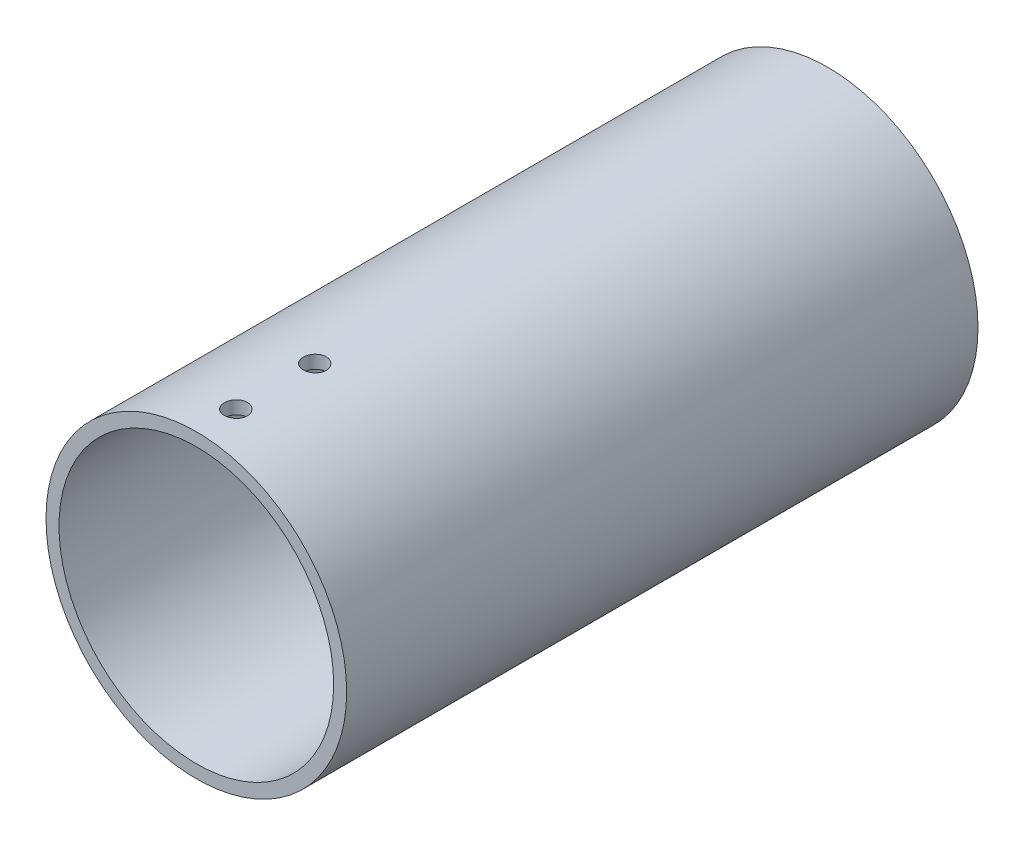
ISO-10303-21;
HEADER;
FILE_DESCRIPTION(('STEP AP214'),'2;1');
FILE_NAME('part.step','',(''),(''),'','','');
FILE_SCHEMA(('AUTOMOTIVE_DESIGN { 1 0 10303 214 1 1 1 1 }'));
ENDSEC;
DATA;
#1=APPLICATION_CONTEXT('core data for automotive mechanical design processes');
#2=APPLICATION_PROTOCOL_DEFINITION('international standard','automotive_design',2000,#1);
#3=PRODUCT_CONTEXT('',#1,'mechanical');
#4=PRODUCT('Part','Part','',(#3));
#5=PRODUCT_RELATED_PRODUCT_CATEGORY('part','',(#4));
#6=PRODUCT_DEFINITION_FORMATION('','',#4);
#7=PRODUCT_DEFINITION_CONTEXT('part definition',#1,'design');
#8=PRODUCT_DEFINITION('design','',#6,#7);
#9=PRODUCT_DEFINITION_SHAPE('','',#8);
#10=(LENGTH_UNIT() NAMED_UNIT(*) SI_UNIT(.MILLI.,.METRE.));
#11=(NAMED_UNIT(*) PLANE_ANGLE_UNIT() SI_UNIT($,.RADIAN.));
#12=(NAMED_UNIT(*) SI_UNIT($,.STERADIAN.) SOLID_ANGLE_UNIT());
#13=UNCERTAINTY_MEASURE_WITH_UNIT(LENGTH_MEASURE(1.E-05),#10,'distance_accuracy_value','');
#14=(GEOMETRIC_REPRESENTATION_CONTEXT(3) GLOBAL_UNCERTAINTY_ASSIGNED_CONTEXT((#13)) GLOBAL_UNIT_ASSIGNED_CONTEXT((#10,
#11,#12)) REPRESENTATION_CONTEXT('',''));
#15=CARTESIAN_POINT('',(0.,0.,0.));
#16=DIRECTION('',(0.,0.,1.));
#17=DIRECTION('',(1.,0.,0.));
#18=AXIS2_PLACEMENT_3D('',#15,#16,#17);
#19=CARTESIAN_POINT('',(0.,0.,80.));
#20=DIRECTION('',(0.,0.,-1.));
#21=DIRECTION('',(-1.,0.,0.));
#22=AXIS2_PLACEMENT_3D('',#19,#20,#21);
#23=CYLINDRICAL_SURFACE('',#22,19.05);
#24=CARTESIAN_POINT('',(0.,0.,80.));
#25=DIRECTION('',(0.,0.,1.));
#26=DIRECTION('',(1.,0.,0.));
#27=AXIS2_PLACEMENT_3D('',#24,#25,#26);
#28=CIRCLE('',#27,19.05);
#29=CARTESIAN_POINT('',(19.05,0.,80.));
#30=VERTEX_POINT('',#29);
#31=EDGE_CURVE('E10',#30,#30,#28,.T.);
#32=ORIENTED_EDGE('',*,*,#31,.F.);
#33=EDGE_LOOP('',(#32));
#34=FACE_BOUND('',#33,.T.);
#35=CARTESIAN_POINT('',(0.,0.,0.));
#36=DIRECTION('',(0.,0.,1.));
#37=DIRECTION('',(1.,0.,0.));
#38=AXIS2_PLACEMENT_3D('',#35,#36,#37);
#39=CIRCLE('',#38,19.05);
#40=CARTESIAN_POINT('',(19.05,0.,0.));
#41=VERTEX_POINT('',#40);
#42=EDGE_CURVE('E46',#41,#41,#39,.T.);
#43=ORIENTED_EDGE('',*,*,#42,.T.);
#44=EDGE_LOOP('',(#43));
#45=FACE_BOUND('',#44,.T.);
#46=CARTESIAN_POINT('',(0.,19.05,63.55));
#47=CARTESIAN_POINT('',(-0.0813208494830457,19.0499992729257,63.5500035622873));
#48=CARTESIAN_POINT('',(-0.162697657982737,19.0494737272168,63.5568641206488));
#49=CARTESIAN_POINT('',(-0.323201460018307,19.0474277490183,63.5841321941853));
#50=CARTESIAN_POINT('',(-0.402325770014953,19.0459061777403,63.604555216153));
#51=CARTESIAN_POINT('',(-0.55597663122478,19.0420401637007,63.6583557255923));
#52=CARTESIAN_POINT('',(-0.630505691202798,19.0396961746977,63.691726070616));
#53=CARTESIAN_POINT('',(-0.77288617027345,19.0344484812242,63.7704616268439));
#54=CARTESIAN_POINT('',(-0.840739051379646,19.0315448997125,63.8158242038162));
#55=CARTESIAN_POINT('',(-0.96800550226609,19.0254970660228,63.9173623582976));
#56=CARTESIAN_POINT('',(-1.02740275286289,19.0223523660085,63.9735583651256));
#57=CARTESIAN_POINT('',(-1.13593198857298,19.0161805027123,64.0951252971086));
#58=CARTESIAN_POINT('',(-1.1850635312591,19.0131533445007,64.1604966174945));
#59=CARTESIAN_POINT('',(-1.27172050512056,19.0075543319599,64.2986554965038));
#60=CARTESIAN_POINT('',(-1.30923182211138,19.0049830329354,64.3714519323571));
#61=CARTESIAN_POINT('',(-1.37149333961383,19.0005917241333,64.5223326242051));
#62=CARTESIAN_POINT('',(-1.39624373199115,18.9987717030601,64.6004168006764));
#63=CARTESIAN_POINT('',(-1.43223407702103,18.9960925982056,64.7594946824739));
#64=CARTESIAN_POINT('',(-1.44350033286174,18.9952316438237,64.8404824048563));
#65=CARTESIAN_POINT('',(-1.45228383416612,18.9945621706972,65.0032036226505));
#66=CARTESIAN_POINT('',(-1.44980129885398,18.9947536351718,65.0849371061504));
#67=CARTESIAN_POINT('',(-1.43117945518972,18.996165673315,65.2466498703818));
#68=CARTESIAN_POINT('',(-1.41506868528936,18.997384096443,65.3266324588216));
#69=CARTESIAN_POINT('',(-1.36969200884703,19.0007093805456,65.4827548875062));
#70=CARTESIAN_POINT('',(-1.34042599254899,19.0028162489325,65.5588946956841));
#71=CARTESIAN_POINT('',(-1.26953745571371,19.0076834950449,65.7052614679711));
#72=CARTESIAN_POINT('',(-1.2279020774928,19.0104445521777,65.7754821813221));
#73=CARTESIAN_POINT('',(-1.13346597695597,19.016308410931,65.9079491096538));
#74=CARTESIAN_POINT('',(-1.08066506656583,19.0194112183075,65.9701951902799));
#75=CARTESIAN_POINT('',(-0.965236408537407,19.0256185114098,66.085111890507));
#76=CARTESIAN_POINT('',(-0.902583979241591,19.0287229812888,66.1377577225386));
#77=CARTESIAN_POINT('',(-0.769317019785275,19.0345762326859,66.2317880249525));
#78=CARTESIAN_POINT('',(-0.698702485388893,19.0373250140149,66.2731724893436));
#79=CARTESIAN_POINT('',(-0.551500096726652,19.0421575652253,66.3435035516848));
#80=CARTESIAN_POINT('',(-0.474911744763708,19.0442412796243,66.372449112001));
#81=CARTESIAN_POINT('',(-0.31794291823663,19.0475082402431,66.4170636560945));
#82=CARTESIAN_POINT('',(-0.237562509351747,19.0486915020529,66.4327328697319));
#83=CARTESIAN_POINT('',(-0.0755062059068249,19.0500222298809,66.4503189890923));
#84=CARTESIAN_POINT('',(0.0061659515649958,19.0501722755637,66.4522701453969));
#85=CARTESIAN_POINT('',(0.168676276613854,19.0494265437844,66.4424544002631));
#86=CARTESIAN_POINT('',(0.249514450658992,19.0485307744395,66.4306876052975));
#87=CARTESIAN_POINT('',(0.407964896263582,19.045795849195,66.3937983509771));
#88=CARTESIAN_POINT('',(0.485580870568152,19.0439578104614,66.3686917062295));
#89=CARTESIAN_POINT('',(0.635498227366434,19.0395449388627,66.3058515549985));
#90=CARTESIAN_POINT('',(0.707799539388619,19.0369700962298,66.2681178811197));
#91=CARTESIAN_POINT('',(0.845191443970697,19.0313660777045,66.1810082959473));
#92=CARTESIAN_POINT('',(0.910267569227839,19.0283360178592,66.1316096241153));
#93=CARTESIAN_POINT('',(1.03121594136035,19.022165184916,66.0226052625939));
#94=CARTESIAN_POINT('',(1.08708805471953,19.0190244102128,65.962999424862));
#95=CARTESIAN_POINT('',(1.18815933385557,19.0129785526043,65.8351244163525));
#96=CARTESIAN_POINT('',(1.23333619816994,19.0100739703333,65.766837591767));
#97=CARTESIAN_POINT('',(1.31158180279568,19.0048361620861,65.6236272112266));
#98=CARTESIAN_POINT('',(1.34465064669224,19.0025029312221,65.548703712056));
#99=CARTESIAN_POINT('',(1.39770327759728,18.9986746155864,65.3944266933331));
#100=CARTESIAN_POINT('',(1.41770086172064,18.9971786472991,65.3150779411332));
#101=CARTESIAN_POINT('',(1.44408828980572,18.9951911506433,65.1541372037776));
#102=CARTESIAN_POINT('',(1.45047834703204,18.994699606533,65.0725452537989));
#103=CARTESIAN_POINT('',(1.44946703905592,18.9947767883759,64.909655870581));
#104=CARTESIAN_POINT('',(1.44210072032826,18.9953428199948,64.8283582161707));
#105=CARTESIAN_POINT('',(1.41385868610037,18.9974656557984,64.6681580513888));
#106=CARTESIAN_POINT('',(1.39298294834949,18.9990224616148,64.5892555449622));
#107=CARTESIAN_POINT('',(1.33832320082262,19.002950733469,64.4360820932478));
#108=CARTESIAN_POINT('',(1.30453965494641,19.005322170229,64.3618109816216));
#109=CARTESIAN_POINT('',(1.22502744089685,19.0106125193006,64.2199893470956));
#110=CARTESIAN_POINT('',(1.17929900616275,19.0135314209129,64.1524386928933));
#111=CARTESIAN_POINT('',(1.07706377742759,19.019596598861,64.0257964955096));
#112=CARTESIAN_POINT('',(1.02053118152052,19.0227434080684,63.9667258073963));
#113=CARTESIAN_POINT('',(0.898336147686061,19.0289050209962,63.8588896422513));
#114=CARTESIAN_POINT('',(0.832671494924629,19.0319197924589,63.8101266724432));
#115=CARTESIAN_POINT('',(0.693969654148835,19.0374821834565,63.724236122242));
#116=CARTESIAN_POINT('',(0.62092068394173,19.0400290375594,63.6871275372988));
#117=CARTESIAN_POINT('',(0.469660629150879,19.0443592659936,63.6257490146474));
#118=CARTESIAN_POINT('',(0.391455639531667,19.0461435237588,63.601464213431));
#119=CARTESIAN_POINT('',(0.260652232296499,19.0482858536481,63.5726557124547));
#120=CARTESIAN_POINT('',(0.208896734831719,19.0489257586698,63.5641709957713));
#121=CARTESIAN_POINT('',(0.10476856756679,19.0497830656221,63.5528419980021));
#122=CARTESIAN_POINT('',(0.0523958990948468,19.0500004684618,63.5499977047799));
#123=CARTESIAN_POINT('',(0.,19.05,63.55));
#124=B_SPLINE_CURVE_WITH_KNOTS('',3,(#46,#47,#48,#49,#50,#51,#52,#53,#54,#55,#56,#57,#58,#59,
#60,#61,#62,#63,#64,#65,#66,#67,#68,#69,#70,#71,#72,#73,#74,#75,#76,#77,#78,#79,#80,#81,#82,#83,
#84,#85,#86,#87,#88,#89,#90,#91,#92,#93,#94,#95,#96,#97,#98,#99,#100,#101,#102,#103,#104,#105,
#106,#107,#108,#109,#110,#111,#112,#113,#114,#115,#116,#117,#118,#119,#120,#121,#122,#123),
.UNSPECIFIED.,.T.,.F.,(4,2,2,2,2,2,2,2,2,2,2,2,2,2,2,2,2,2,2,2,2,2,2,2,2,2,2,2,2,2,2,2,2,2,2,2,
2,2,4),(0.,0.243771256204985,0.487821711956081,0.73173772718129,0.975600207898734,
1.21992713605075,1.46426459193112,1.70889767229548,1.95352707439461,2.19767850184943,
2.44182603632608,2.68546357126808,2.92910313895,3.17299685612479,3.41689468181602,
3.66141359364039,3.9059326355507,4.15047207089759,4.39500727232226,4.6389317125782,
4.88285425961241,5.12648827564305,5.37012552163721,5.61424213463201,5.85836228854453,
6.10298707837145,6.34760977536262,6.59197384684753,6.836334088497,7.08007263414094,
7.32381158123454,7.56754176930334,7.81126719450392,8.05558211388458,8.29995639160803,
8.54472693165783,8.78921314228026,8.94627792586699,9.10334237149848),.UNSPECIFIED.);
#125=CARTESIAN_POINT('',(0.,19.05,63.55));
#126=VERTEX_POINT('',#125);
#127=EDGE_CURVE('E62',#126,#126,#124,.T.);
#128=ORIENTED_EDGE('',*,*,#127,.F.);
#129=EDGE_LOOP('',(#128));
#130=FACE_BOUND('',#129,.T.);
#131=CARTESIAN_POINT('',(0.,19.05,73.55));
#132=CARTESIAN_POINT('',(-0.0813208494830448,19.0499992729257,73.5500035622873));
#133=CARTESIAN_POINT('',(-0.162697657982736,19.0494737272168,73.5568641206488));
#134=CARTESIAN_POINT('',(-0.323201460018307,19.0474277490183,73.5841321941853));
#135=CARTESIAN_POINT('',(-0.402325770014951,19.0459061777403,73.604555216153));
#136=CARTESIAN_POINT('',(-0.555976631224778,19.0420401637007,73.6583557255923));
#137=CARTESIAN_POINT('',(-0.630505691202798,19.0396961746977,73.691726070616));
#138=CARTESIAN_POINT('',(-0.772886170273451,19.0344484812242,73.7704616268439));
#139=CARTESIAN_POINT('',(-0.840739051379648,19.0315448997125,73.8158242038162));
#140=CARTESIAN_POINT('',(-0.968005502266088,19.0254970660228,73.9173623582976));
#141=CARTESIAN_POINT('',(-1.02740275286289,19.0223523660085,73.9735583651256));
#142=CARTESIAN_POINT('',(-1.13593198857298,19.0161805027123,74.0951252971086));
#143=CARTESIAN_POINT('',(-1.18506353125909,19.0131533445007,74.1604966174945));
#144=CARTESIAN_POINT('',(-1.27172050512056,19.0075543319599,74.2986554965038));
#145=CARTESIAN_POINT('',(-1.30923182211138,19.0049830329354,74.3714519323571));
#146=CARTESIAN_POINT('',(-1.37149333961383,19.0005917241333,74.5223326242051));
#147=CARTESIAN_POINT('',(-1.39624373199116,18.9987717030601,74.6004168006764));
#148=CARTESIAN_POINT('',(-1.43223407702103,18.9960925982056,74.7594946824739));
#149=CARTESIAN_POINT('',(-1.44350033286174,18.9952316438237,74.8404824048563));
#150=CARTESIAN_POINT('',(-1.45228383416612,18.9945621706972,75.0032036226505));
#151=CARTESIAN_POINT('',(-1.44980129885398,18.9947536351718,75.0849371061504));
#152=CARTESIAN_POINT('',(-1.43117945518972,18.996165673315,75.2466498703818));
#153=CARTESIAN_POINT('',(-1.41506868528936,18.997384096443,75.3266324588216));
#154=CARTESIAN_POINT('',(-1.36969200884702,19.0007093805456,75.4827548875062));
#155=CARTESIAN_POINT('',(-1.34042599254899,19.0028162489325,75.5588946956841));
#156=CARTESIAN_POINT('',(-1.26953745571371,19.0076834950449,75.7052614679711));
#157=CARTESIAN_POINT('',(-1.2279020774928,19.0104445521777,75.7754821813221));
#158=CARTESIAN_POINT('',(-1.13346597695596,19.016308410931,75.9079491096538));
#159=CARTESIAN_POINT('',(-1.08066506656583,19.0194112183075,75.9701951902799));
#160=CARTESIAN_POINT('',(-0.965236408537409,19.0256185114098,76.0851118905069));
#161=CARTESIAN_POINT('',(-0.90258397924159,19.0287229812888,76.1377577225386));
#162=CARTESIAN_POINT('',(-0.769317019785273,19.0345762326859,76.2317880249525));
#163=CARTESIAN_POINT('',(-0.698702485388895,19.0373250140149,76.2731724893436));
#164=CARTESIAN_POINT('',(-0.551500096726656,19.0421575652253,76.3435035516848));
#165=CARTESIAN_POINT('',(-0.474911744763709,19.0442412796243,76.372449112001));
#166=CARTESIAN_POINT('',(-0.317942918236631,19.0475082402431,76.4170636560945));
#167=CARTESIAN_POINT('',(-0.237562509351749,19.0486915020529,76.4327328697319));
#168=CARTESIAN_POINT('',(-0.0755062059068279,19.0500222298809,76.4503189890923));
#169=CARTESIAN_POINT('',(0.00616595156499384,19.0501722755637,76.4522701453969));
#170=CARTESIAN_POINT('',(0.168676276613854,19.0494265437844,76.4424544002631));
#171=CARTESIAN_POINT('',(0.249514450658992,19.0485307744395,76.4306876052975));
#172=CARTESIAN_POINT('',(0.407964896263583,19.045795849195,76.3937983509771));
#173=CARTESIAN_POINT('',(0.485580870568153,19.0439578104614,76.3686917062295));
#174=CARTESIAN_POINT('',(0.635498227366438,19.0395449388627,76.3058515549985));
#175=CARTESIAN_POINT('',(0.707799539388626,19.0369700962298,76.2681178811197));
#176=CARTESIAN_POINT('',(0.845191443970698,19.0313660777045,76.1810082959474));
#177=CARTESIAN_POINT('',(0.910267569227833,19.0283360178592,76.1316096241153));
#178=CARTESIAN_POINT('',(1.03121594136034,19.022165184916,76.0226052625939));
#179=CARTESIAN_POINT('',(1.08708805471954,19.0190244102128,75.962999424862));
#180=CARTESIAN_POINT('',(1.18815933385557,19.0129785526043,75.8351244163525));
#181=CARTESIAN_POINT('',(1.23333619816994,19.0100739703333,75.766837591767));
#182=CARTESIAN_POINT('',(1.31158180279568,19.0048361620861,75.6236272112266));
#183=CARTESIAN_POINT('',(1.34465064669224,19.0025029312221,75.548703712056));
#184=CARTESIAN_POINT('',(1.39770327759728,18.9986746155864,75.3944266933331));
#185=CARTESIAN_POINT('',(1.41770086172064,18.9971786472991,75.3150779411332));
#186=CARTESIAN_POINT('',(1.44408828980573,18.9951911506433,75.1541372037776));
#187=CARTESIAN_POINT('',(1.45047834703205,18.994699606533,75.0725452537989));
#188=CARTESIAN_POINT('',(1.44946703905593,18.9947767883759,74.909655870581));
#189=CARTESIAN_POINT('',(1.44210072032827,18.9953428199948,74.8283582161707));
#190=CARTESIAN_POINT('',(1.41385868610037,18.9974656557984,74.6681580513888));
#191=CARTESIAN_POINT('',(1.3929829483495,18.9990224616148,74.5892555449622));
#192=CARTESIAN_POINT('',(1.33832320082263,19.002950733469,74.4360820932478));
#193=CARTESIAN_POINT('',(1.30453965494641,19.005322170229,74.3618109816216));
#194=CARTESIAN_POINT('',(1.22502744089686,19.0106125193006,74.2199893470956));
#195=CARTESIAN_POINT('',(1.17929900616275,19.0135314209129,74.1524386928933));
#196=CARTESIAN_POINT('',(1.0770637774276,19.019596598861,74.0257964955096));
#197=CARTESIAN_POINT('',(1.02053118152053,19.0227434080684,73.9667258073963));
#198=CARTESIAN_POINT('',(0.898336147686073,19.0289050209962,73.8588896422513));
#199=CARTESIAN_POINT('',(0.832671494924637,19.0319197924589,73.8101266724432));
#200=CARTESIAN_POINT('',(0.693969654148842,19.0374821834565,73.724236122242));
#201=CARTESIAN_POINT('',(0.62092068394174,19.0400290375594,73.6871275372988));
#202=CARTESIAN_POINT('',(0.46966062915089,19.0443592659936,73.6257490146474));
#203=CARTESIAN_POINT('',(0.391455639531676,19.0461435237588,73.6014642134309));
#204=CARTESIAN_POINT('',(0.260652232296507,19.0482858536481,73.5726557124547));
#205=CARTESIAN_POINT('',(0.208896734831726,19.0489257586698,73.5641709957713));
#206=CARTESIAN_POINT('',(0.104768567566796,19.0497830656221,73.5528419980021));
#207=CARTESIAN_POINT('',(0.0523958990948508,19.0500004684618,73.5499977047799));
#208=CARTESIAN_POINT('',(0.,19.05,73.55));
#209=B_SPLINE_CURVE_WITH_KNOTS('',3,(#131,#132,#133,#134,#135,#136,#137,#138,#139,#140,#141,
#142,#143,#144,#145,#146,#147,#148,#149,#150,#151,#152,#153,#154,#155,#156,#157,#158,#159,#160,
#161,#162,#163,#164,#165,#166,#167,#168,#169,#170,#171,#172,#173,#174,#175,#176,#177,#178,#179,
#180,#181,#182,#183,#184,#185,#186,#187,#188,#189,#190,#191,#192,#193,#194,#195,#196,#197,#198,
#199,#200,#201,#202,#203,#204,#205,#206,#207,#208),.UNSPECIFIED.,.T.,.F.,(4,2,2,2,2,2,2,2,2,2,2,
2,2,2,2,2,2,2,2,2,2,2,2,2,2,2,2,2,2,2,2,2,2,2,2,2,2,2,4),(0.,0.243771256204988,
0.487821711956081,0.731737727181293,0.975600207898737,1.21992713605075,1.46426459193113,
1.70889767229548,1.95352707439462,2.19767850184944,2.44182603632608,2.6854635712681,
2.92910313895,3.17299685612479,3.41689468181602,3.6614135936404,3.9059326355507,
4.15047207089759,4.39500727232226,4.6389317125782,4.88285425961242,5.12648827564305,
5.37012552163721,5.61424213463201,5.85836228854453,6.10298707837145,6.34760977536263,
6.59197384684755,6.83633408849701,7.08007263414095,7.32381158123455,7.56754176930336,
7.81126719450394,8.05558211388459,8.29995639160804,8.54472693165783,8.78921314228027,
8.946277925867,9.1033423714985),.UNSPECIFIED.);
#210=CARTESIAN_POINT('',(0.,19.05,73.55));
#211=VERTEX_POINT('',#210);
#212=EDGE_CURVE('E80',#211,#211,#209,.T.);
#213=ORIENTED_EDGE('',*,*,#212,.F.);
#214=EDGE_LOOP('',(#213));
#215=FACE_BOUND('',#214,.T.);
#216=ADVANCED_FACE('F33',(#34,#45,#130,#215),#23,.T.);
#217=CARTESIAN_POINT('',(0.,0.,80.));
#218=DIRECTION('',(0.,0.,-1.));
#219=DIRECTION('',(-1.,0.,0.));
#220=AXIS2_PLACEMENT_3D('',#217,#218,#219);
#221=CYLINDRICAL_SURFACE('',#220,17.4);
#222=CARTESIAN_POINT('',(0.,17.4,63.55));
#223=CARTESIAN_POINT('',(-0.0812958303857374,17.399999208467,63.5500035507981));
#224=CARTESIAN_POINT('',(-0.162647003411317,17.3994241838792,63.556859906226));
#225=CARTESIAN_POINT('',(-0.323098527515556,17.3971855837596,63.5841103101899));
#226=CARTESIAN_POINT('',(-0.402196222576576,17.3955207750096,63.6045196959421));
#227=CARTESIAN_POINT('',(-0.555793732645668,17.3912907380685,63.6582818730236));
#228=CARTESIAN_POINT('',(-0.630296121615677,17.388726019428,63.6916273407592));
#229=CARTESIAN_POINT('',(-0.772628488453297,17.3829837822983,63.7703020262144));
#230=CARTESIAN_POINT('',(-0.840459889333806,17.3798063949297,63.8156286805424));
#231=CARTESIAN_POINT('',(-0.9677154999501,17.3731863080673,63.9171038465787));
#232=CARTESIAN_POINT('',(-1.02712036500342,17.3697430252554,63.9732765817067));
#233=CARTESIAN_POINT('',(-1.13567064362799,17.3629841216459,64.0947981989824));
#234=CARTESIAN_POINT('',(-1.18481560648867,17.3596685064621,64.1601474840388));
#235=CARTESIAN_POINT('',(-1.27151648746582,17.353534063588,64.2982842697936));
#236=CARTESIAN_POINT('',(-1.30905540777973,17.3507159671113,64.371082474334));
#237=CARTESIAN_POINT('',(-1.37137002897207,17.3459023045,64.5219760285562));
#238=CARTESIAN_POINT('',(-1.396145955293,17.3439067238367,64.6000712846445));
#239=CARTESIAN_POINT('',(-1.43217519323692,17.3409689349617,64.7591483182277));
#240=CARTESIAN_POINT('',(-1.44346001481517,17.3400242725752,64.8401229129893));
#241=CARTESIAN_POINT('',(-1.45228405162236,17.3392875186614,65.0028219957208));
#242=CARTESIAN_POINT('',(-1.44982352482033,17.3394954055034,65.0845464695884));
#243=CARTESIAN_POINT('',(-1.43125275311153,17.3410380317437,65.2462095149902));
#244=CARTESIAN_POINT('',(-1.41517675365518,17.3423699439789,65.3261520511608));
#245=CARTESIAN_POINT('',(-1.36988457880526,17.3460061117558,65.4822002077198));
#246=CARTESIAN_POINT('',(-1.34066827507534,17.3483103767942,65.5583057906261));
#247=CARTESIAN_POINT('',(-1.26988649282045,17.3536348682494,65.7046288135232));
#248=CARTESIAN_POINT('',(-1.22830564989793,17.356655984489,65.7748387875019));
#249=CARTESIAN_POINT('',(-1.13398619367435,17.3630729495263,65.9072959412887));
#250=CARTESIAN_POINT('',(-1.08124735440268,17.3664688059125,65.969542959791));
#251=CARTESIAN_POINT('',(-0.96591689422822,17.3732651959689,66.0845063579583));
#252=CARTESIAN_POINT('',(-0.903295667616332,17.3766657122385,66.1371930429874));
#253=CARTESIAN_POINT('',(-0.770081306739038,17.3830783821126,66.2313105989134));
#254=CARTESIAN_POINT('',(-0.699488167147237,17.3860905354576,66.2727414622897));
#255=CARTESIAN_POINT('',(-0.55231456023838,17.3913876642398,66.3431694558696));
#256=CARTESIAN_POINT('',(-0.475733460623153,17.3936725627529,66.3721652708933));
#257=CARTESIAN_POINT('',(-0.318766650078391,17.3972568524711,66.4168792920544));
#258=CARTESIAN_POINT('',(-0.238381018144838,17.3985562641288,66.4325977737501));
#259=CARTESIAN_POINT('',(-0.0763443852381621,17.4000205456742,66.4502737078603));
#260=CARTESIAN_POINT('',(0.00530211221703721,17.400188797134,66.452272176255));
#261=CARTESIAN_POINT('',(0.167768991129795,17.3993808322912,66.4425588020904));
#262=CARTESIAN_POINT('',(0.248589380286055,17.3984046266638,66.4308470874173));
#263=CARTESIAN_POINT('',(0.406992896525821,17.3954197086991,66.3940797950154));
#264=CARTESIAN_POINT('',(0.484580466452605,17.3934124675526,66.3690432287626));
#265=CARTESIAN_POINT('',(0.634453539369617,17.3885909666291,66.3063563477161));
#266=CARTESIAN_POINT('',(0.706738958510549,17.385776694093,66.2687058334952));
#267=CARTESIAN_POINT('',(0.844142466537769,17.3796481827077,66.1817567436363));
#268=CARTESIAN_POINT('',(0.909243308256133,17.3763327841717,66.1324309957275));
#269=CARTESIAN_POINT('',(1.03025558752325,17.3695784002756,66.0235708672768));
#270=CARTESIAN_POINT('',(1.08616686538086,17.3661394127691,65.9640363093686));
#271=CARTESIAN_POINT('',(1.1873535909099,17.3595154376294,65.8362705463124));
#272=CARTESIAN_POINT('',(1.23260227318878,17.3563311021762,65.7680181052638));
#273=CARTESIAN_POINT('',(1.3109958411173,17.3505862002927,65.6248597188481));
#274=CARTESIAN_POINT('',(1.34414084761445,17.3480256276345,65.5499538399206));
#275=CARTESIAN_POINT('',(1.39734060728883,17.3438218213096,65.3957096537181));
#276=CARTESIAN_POINT('',(1.41741174510148,17.3421774398152,65.3163770301642));
#277=CARTESIAN_POINT('',(1.44394736636973,17.3399883525173,65.1554534851821));
#278=CARTESIAN_POINT('',(1.450412111124,17.339443625596,65.0738626071521));
#279=CARTESIAN_POINT('',(1.44954841619186,17.3395158302778,64.9110046172697));
#280=CARTESIAN_POINT('',(1.44226203117723,17.3401292200495,64.8297372775072));
#281=CARTESIAN_POINT('',(1.4141906017778,17.3424410186934,64.6695848263513));
#282=CARTESIAN_POINT('',(1.39340553680507,17.3441394292205,64.5906997185914));
#283=CARTESIAN_POINT('',(1.33893740952475,17.3484289684097,64.4375482432634));
#284=CARTESIAN_POINT('',(1.30525510430949,17.3510200446697,64.3632816048798));
#285=CARTESIAN_POINT('',(1.22595333547353,17.3568030481885,64.2214502811682));
#286=CARTESIAN_POINT('',(1.18033405921612,17.3599949660162,64.1538854906707));
#287=CARTESIAN_POINT('',(1.07829531607756,17.3666316096309,64.0271605784311));
#288=CARTESIAN_POINT('',(1.02184471592513,17.3700770460833,63.9680255624469));
#289=CARTESIAN_POINT('',(0.899802177109086,17.3768260276403,63.8600459814552));
#290=CARTESIAN_POINT('',(0.834208029829594,17.38012953821,63.8112039098808));
#291=CARTESIAN_POINT('',(0.695613970892664,17.386228405213,63.7251312023945));
#292=CARTESIAN_POINT('',(0.622600501592294,17.389022804335,63.6879223489483));
#293=CARTESIAN_POINT('',(0.471388840393827,17.3937773614863,63.6263398855756));
#294=CARTESIAN_POINT('',(0.393196725349807,17.3957384779597,63.6019515217822));
#295=CARTESIAN_POINT('',(0.262119469740197,17.3981020621408,63.572913505372));
#296=CARTESIAN_POINT('',(0.210077296935794,17.3988105487158,63.5643323618497));
#297=CARTESIAN_POINT('',(0.105364498676696,17.3997597735502,63.5528744659681));
#298=CARTESIAN_POINT('',(0.0526938748909244,17.4000005130514,63.5499976984636));
#299=CARTESIAN_POINT('',(0.,17.4,63.55));
#300=B_SPLINE_CURVE_WITH_KNOTS('',3,(#222,#223,#224,#225,#226,#227,#228,#229,#230,#231,#232,
#233,#234,#235,#236,#237,#238,#239,#240,#241,#242,#243,#244,#245,#246,#247,#248,#249,#250,#251,
#252,#253,#254,#255,#256,#257,#258,#259,#260,#261,#262,#263,#264,#265,#266,#267,#268,#269,#270,
#271,#272,#273,#274,#275,#276,#277,#278,#279,#280,#281,#282,#283,#284,#285,#286,#287,#288,#289,
#290,#291,#292,#293,#294,#295,#296,#297,#298,#299),.UNSPECIFIED.,.T.,.F.,(4,2,2,2,2,2,2,2,2,2,2,
2,2,2,2,2,2,2,2,2,2,2,2,2,2,2,2,2,2,2,2,2,2,2,2,2,2,2,4),(0.,0.2436951008602,0.48766644904686,
0.731499877138978,0.975281178897067,1.21961336973935,1.463956291672,1.70865539279083,
1.95335017145456,2.197472315058,2.44158987705797,2.68509525509919,2.92860301141648,
3.17241462835904,3.41623118342248,3.66079253855967,3.90535405710035,4.14994143506153,
4.39452373672176,4.63837453995395,4.88222306860621,5.12572461094639,5.3692300032399,
5.61330778713644,5.85738981203313,6.10207815912242,6.34676406308751,6.59114272499348,
6.83551669378199,7.07914451179665,7.32277270138893,7.56638659173908,7.80999665854292,
8.05431773563727,8.29869793087097,8.54353300940703,8.7880857105809,8.94604305217161,
9.10399997438183),.UNSPECIFIED.);
#301=CARTESIAN_POINT('',(0.,17.4,63.55));
#302=VERTEX_POINT('',#301);
#303=EDGE_CURVE('E56',#302,#302,#300,.T.);
#304=ORIENTED_EDGE('',*,*,#303,.T.);
#305=EDGE_LOOP('',(#304));
#306=FACE_BOUND('',#305,.T.);
#307=CARTESIAN_POINT('',(0.,0.,80.));
#308=DIRECTION('',(0.,0.,1.));
#309=DIRECTION('',(1.,0.,0.));
#310=AXIS2_PLACEMENT_3D('',#307,#308,#309);
#311=CIRCLE('',#310,17.4);
#312=CARTESIAN_POINT('',(17.4,0.,80.));
#313=VERTEX_POINT('',#312);
#314=EDGE_CURVE('E51',#313,#313,#311,.T.);
#315=ORIENTED_EDGE('',*,*,#314,.T.);
#316=EDGE_LOOP('',(#315));
#317=FACE_BOUND('',#316,.T.);
#318=CARTESIAN_POINT('',(0.,0.,0.));
#319=DIRECTION('',(0.,0.,1.));
#320=DIRECTION('',(1.,0.,0.));
#321=AXIS2_PLACEMENT_3D('',#318,#319,#320);
#322=CIRCLE('',#321,17.4);
#323=CARTESIAN_POINT('',(17.4,0.,0.));
#324=VERTEX_POINT('',#323);
#325=EDGE_CURVE('E54',#324,#324,#322,.T.);
#326=ORIENTED_EDGE('',*,*,#325,.F.);
#327=EDGE_LOOP('',(#326));
#328=FACE_BOUND('',#327,.T.);
#329=CARTESIAN_POINT('',(0.,17.4,73.55));
#330=CARTESIAN_POINT('',(-0.0812958303857361,17.399999208467,73.5500035507981));
#331=CARTESIAN_POINT('',(-0.162647003411317,17.3994241838792,73.556859906226));
#332=CARTESIAN_POINT('',(-0.323098527515555,17.3971855837596,73.5841103101899));
#333=CARTESIAN_POINT('',(-0.402196222576574,17.3955207750096,73.6045196959421));
#334=CARTESIAN_POINT('',(-0.55579373264567,17.3912907380685,73.6582818730236));
#335=CARTESIAN_POINT('',(-0.630296121615685,17.388726019428,73.6916273407592));
#336=CARTESIAN_POINT('',(-0.772628488453301,17.3829837822983,73.7703020262144));
#337=CARTESIAN_POINT('',(-0.840459889333803,17.3798063949297,73.8156286805424));
#338=CARTESIAN_POINT('',(-0.967715499950097,17.3731863080673,73.9171038465787));
#339=CARTESIAN_POINT('',(-1.02712036500343,17.3697430252554,73.9732765817067));
#340=CARTESIAN_POINT('',(-1.135670643628,17.3629841216459,74.0947981989824));
#341=CARTESIAN_POINT('',(-1.18481560648867,17.3596685064621,74.1601474840388));
#342=CARTESIAN_POINT('',(-1.27151648746582,17.353534063588,74.2982842697936));
#343=CARTESIAN_POINT('',(-1.30905540777973,17.3507159671113,74.371082474334));
#344=CARTESIAN_POINT('',(-1.37137002897207,17.3459023045,74.5219760285562));
#345=CARTESIAN_POINT('',(-1.396145955293,17.3439067238367,74.6000712846445));
#346=CARTESIAN_POINT('',(-1.43217519323692,17.3409689349617,74.7591483182277));
#347=CARTESIAN_POINT('',(-1.44346001481517,17.3400242725752,74.8401229129893));
#348=CARTESIAN_POINT('',(-1.45228405162237,17.3392875186614,75.0028219957208));
#349=CARTESIAN_POINT('',(-1.44982352482033,17.3394954055034,75.0845464695884));
#350=CARTESIAN_POINT('',(-1.43125275311153,17.3410380317437,75.2462095149902));
#351=CARTESIAN_POINT('',(-1.41517675365518,17.3423699439789,75.3261520511608));
#352=CARTESIAN_POINT('',(-1.36988457880526,17.3460061117558,75.4822002077198));
#353=CARTESIAN_POINT('',(-1.34066827507533,17.3483103767942,75.5583057906261));
#354=CARTESIAN_POINT('',(-1.26988649282045,17.3536348682494,75.7046288135232));
#355=CARTESIAN_POINT('',(-1.22830564989793,17.356655984489,75.7748387875019));
#356=CARTESIAN_POINT('',(-1.13398619367435,17.3630729495263,75.9072959412887));
#357=CARTESIAN_POINT('',(-1.08124735440268,17.3664688059125,75.969542959791));
#358=CARTESIAN_POINT('',(-0.965916894228221,17.3732651959689,76.0845063579583));
#359=CARTESIAN_POINT('',(-0.90329566761633,17.3766657122385,76.1371930429874));
#360=CARTESIAN_POINT('',(-0.770081306739037,17.3830783821126,76.2313105989134));
#361=CARTESIAN_POINT('',(-0.699488167147238,17.3860905354576,76.2727414622897));
#362=CARTESIAN_POINT('',(-0.552314560238383,17.3913876642398,76.3431694558696));
#363=CARTESIAN_POINT('',(-0.475733460623154,17.3936725627529,76.3721652708933));
#364=CARTESIAN_POINT('',(-0.318766650078387,17.3972568524711,76.4168792920544));
#365=CARTESIAN_POINT('',(-0.238381018144832,17.3985562641288,76.4325977737501));
#366=CARTESIAN_POINT('',(-0.0763443852381546,17.4000205456742,76.4502737078603));
#367=CARTESIAN_POINT('',(0.00530211221704329,17.400188797134,76.452272176255));
#368=CARTESIAN_POINT('',(0.167768991129799,17.3993808322912,76.4425588020904));
#369=CARTESIAN_POINT('',(0.248589380286058,17.3984046266638,76.4308470874173));
#370=CARTESIAN_POINT('',(0.406992896525824,17.3954197086991,76.3940797950154));
#371=CARTESIAN_POINT('',(0.484580466452608,17.3934124675526,76.3690432287626));
#372=CARTESIAN_POINT('',(0.634453539369622,17.3885909666291,76.3063563477161));
#373=CARTESIAN_POINT('',(0.706738958510555,17.385776694093,76.2687058334952));
#374=CARTESIAN_POINT('',(0.844142466537777,17.3796481827077,76.1817567436363));
#375=CARTESIAN_POINT('',(0.90924330825614,17.3763327841717,76.1324309957275));
#376=CARTESIAN_POINT('',(1.03025558752326,17.3695784002756,76.0235708672768));
#377=CARTESIAN_POINT('',(1.08616686538087,17.3661394127691,75.9640363093686));
#378=CARTESIAN_POINT('',(1.18735359090991,17.3595154376294,75.8362705463124));
#379=CARTESIAN_POINT('',(1.23260227318879,17.3563311021762,75.7680181052638));
#380=CARTESIAN_POINT('',(1.31099584111731,17.3505862002927,75.6248597188481));
#381=CARTESIAN_POINT('',(1.34414084761446,17.3480256276345,75.5499538399206));
#382=CARTESIAN_POINT('',(1.39734060728883,17.3438218213096,75.3957096537181));
#383=CARTESIAN_POINT('',(1.41741174510148,17.3421774398152,75.3163770301642));
#384=CARTESIAN_POINT('',(1.44394736636974,17.3399883525173,75.1554534851821));
#385=CARTESIAN_POINT('',(1.450412111124,17.339443625596,75.0738626071521));
#386=CARTESIAN_POINT('',(1.44954841619187,17.3395158302778,74.9110046172697));
#387=CARTESIAN_POINT('',(1.44226203117723,17.3401292200495,74.8297372775072));
#388=CARTESIAN_POINT('',(1.41419060177781,17.3424410186934,74.6695848263513));
#389=CARTESIAN_POINT('',(1.39340553680508,17.3441394292205,74.5906997185915));
#390=CARTESIAN_POINT('',(1.33893740952476,17.3484289684097,74.4375482432634));
#391=CARTESIAN_POINT('',(1.30525510430949,17.3510200446697,74.3632816048798));
#392=CARTESIAN_POINT('',(1.22595333547353,17.3568030481885,74.2214502811682));
#393=CARTESIAN_POINT('',(1.18033405921613,17.3599949660162,74.1538854906707));
#394=CARTESIAN_POINT('',(1.07829531607756,17.3666316096309,74.0271605784311));
#395=CARTESIAN_POINT('',(1.02184471592513,17.3700770460833,73.9680255624468));
#396=CARTESIAN_POINT('',(0.899802177109094,17.3768260276403,73.8600459814552));
#397=CARTESIAN_POINT('',(0.834208029829602,17.38012953821,73.8112039098808));
#398=CARTESIAN_POINT('',(0.695613970892672,17.386228405213,73.7251312023945));
#399=CARTESIAN_POINT('',(0.622600501592301,17.389022804335,73.6879223489483));
#400=CARTESIAN_POINT('',(0.471388840393832,17.3937773614863,73.6263398855756));
#401=CARTESIAN_POINT('',(0.393196725349811,17.3957384779597,73.6019515217822));
#402=CARTESIAN_POINT('',(0.262119469740199,17.3981020621408,73.572913505372));
#403=CARTESIAN_POINT('',(0.210077296935795,17.3988105487158,73.5643323618496));
#404=CARTESIAN_POINT('',(0.105364498676697,17.3997597735502,73.552874465968));
#405=CARTESIAN_POINT('',(0.0526938748909261,17.4000005130514,73.5499976984636));
#406=CARTESIAN_POINT('',(0.,17.4,73.55));
#407=B_SPLINE_CURVE_WITH_KNOTS('',3,(#329,#330,#331,#332,#333,#334,#335,#336,#337,#338,#339,
#340,#341,#342,#343,#344,#345,#346,#347,#348,#349,#350,#351,#352,#353,#354,#355,#356,#357,#358,
#359,#360,#361,#362,#363,#364,#365,#366,#367,#368,#369,#370,#371,#372,#373,#374,#375,#376,#377,
#378,#379,#380,#381,#382,#383,#384,#385,#386,#387,#388,#389,#390,#391,#392,#393,#394,#395,#396,
#397,#398,#399,#400,#401,#402,#403,#404,#405,#406),.UNSPECIFIED.,.T.,.F.,(4,2,2,2,2,2,2,2,2,2,2,
2,2,2,2,2,2,2,2,2,2,2,2,2,2,2,2,2,2,2,2,2,2,2,2,2,2,2,4),(0.,0.243695100860203,
0.487666449046861,0.731499877138989,0.975281178897065,1.21961336973936,1.463956291672,
1.70865539279081,1.95335017145457,2.19747231505802,2.44158987705797,2.6850952550992,
2.92860301141648,3.17241462835904,3.41623118342248,3.66079253855967,3.90535405710035,
4.14994143506154,4.39452373672177,4.63837453995396,4.88222306860622,5.1257246109464,
5.36923000323991,5.61330778713645,5.85738981203315,6.10207815912243,6.34676406308751,
6.59114272499348,6.83551669378199,7.07914451179665,7.32277270138894,7.56638659173909,
7.80999665854293,8.05431773563729,8.29869793087098,8.54353300940705,8.78808571058091,
8.94604305217162,9.10399997438185),.UNSPECIFIED.);
#408=CARTESIAN_POINT('',(0.,17.4,73.55));
#409=VERTEX_POINT('',#408);
#410=EDGE_CURVE('E37',#409,#409,#407,.T.);
#411=ORIENTED_EDGE('',*,*,#410,.T.);
#412=EDGE_LOOP('',(#411));
#413=FACE_BOUND('',#412,.T.);
#414=ADVANCED_FACE('F63',(#306,#317,#328,#413),#221,.F.);
#415=CARTESIAN_POINT('',(0.,0.,80.));
#416=DIRECTION('',(0.,0.,1.));
#417=DIRECTION('',(1.,0.,0.));
#418=AXIS2_PLACEMENT_3D('',#415,#416,#417);
#419=PLANE('',#418);
#420=ORIENTED_EDGE('',*,*,#31,.T.);
#421=EDGE_LOOP('',(#420));
#422=FACE_BOUND('',#421,.T.);
#423=ORIENTED_EDGE('',*,*,#314,.F.);
#424=EDGE_LOOP('',(#423));
#425=FACE_BOUND('',#424,.T.);
#426=ADVANCED_FACE('F94',(#422,#425),#419,.T.);
#427=CARTESIAN_POINT('',(0.,0.,0.));
#428=DIRECTION('',(0.,0.,1.));
#429=DIRECTION('',(1.,0.,0.));
#430=AXIS2_PLACEMENT_3D('',#427,#428,#429);
#431=PLANE('',#430);
#432=ORIENTED_EDGE('',*,*,#42,.F.);
#433=EDGE_LOOP('',(#432));
#434=FACE_BOUND('',#433,.T.);
#435=ORIENTED_EDGE('',*,*,#325,.T.);
#436=EDGE_LOOP('',(#435));
#437=FACE_BOUND('',#436,.T.);
#438=ADVANCED_FACE('F70',(#434,#437),#431,.F.);
#439=CARTESIAN_POINT('',(0.,20.,65.));
#440=DIRECTION('',(0.,-1.,0.));
#441=DIRECTION('',(0.,0.,-1.));
#442=AXIS2_PLACEMENT_3D('',#439,#440,#441);
#443=CYLINDRICAL_SURFACE('',#442,1.45);
#444=ORIENTED_EDGE('',*,*,#303,.F.);
#445=EDGE_LOOP('',(#444));
#446=FACE_BOUND('',#445,.T.);
#447=ORIENTED_EDGE('',*,*,#127,.T.);
#448=EDGE_LOOP('',(#447));
#449=FACE_BOUND('',#448,.T.);
#450=ADVANCED_FACE('F66',(#446,#449),#443,.F.);
#451=CARTESIAN_POINT('',(0.,20.,75.));
#452=DIRECTION('',(0.,-1.,0.));
#453=DIRECTION('',(0.,0.,-1.));
#454=AXIS2_PLACEMENT_3D('',#451,#452,#453);
#455=CYLINDRICAL_SURFACE('',#454,1.45000000000001);
#456=ORIENTED_EDGE('',*,*,#410,.F.);
#457=EDGE_LOOP('',(#456));
#458=FACE_BOUND('',#457,.T.);
#459=ORIENTED_EDGE('',*,*,#212,.T.);
#460=EDGE_LOOP('',(#459));
#461=FACE_BOUND('',#460,.T.);
#462=ADVANCED_FACE('F69',(#458,#461),#455,.F.);
#463=CLOSED_SHELL('',(#216,#414,#426,#438,#450,#462));
#464=MANIFOLD_SOLID_BREP('B2',#463);
#465=ADVANCED_BREP_SHAPE_REPRESENTATION('',(#18,#464),#14);
#466=SHAPE_DEFINITION_REPRESENTATION(#9,#465);
ENDSEC;
END-ISO-10303-21;
